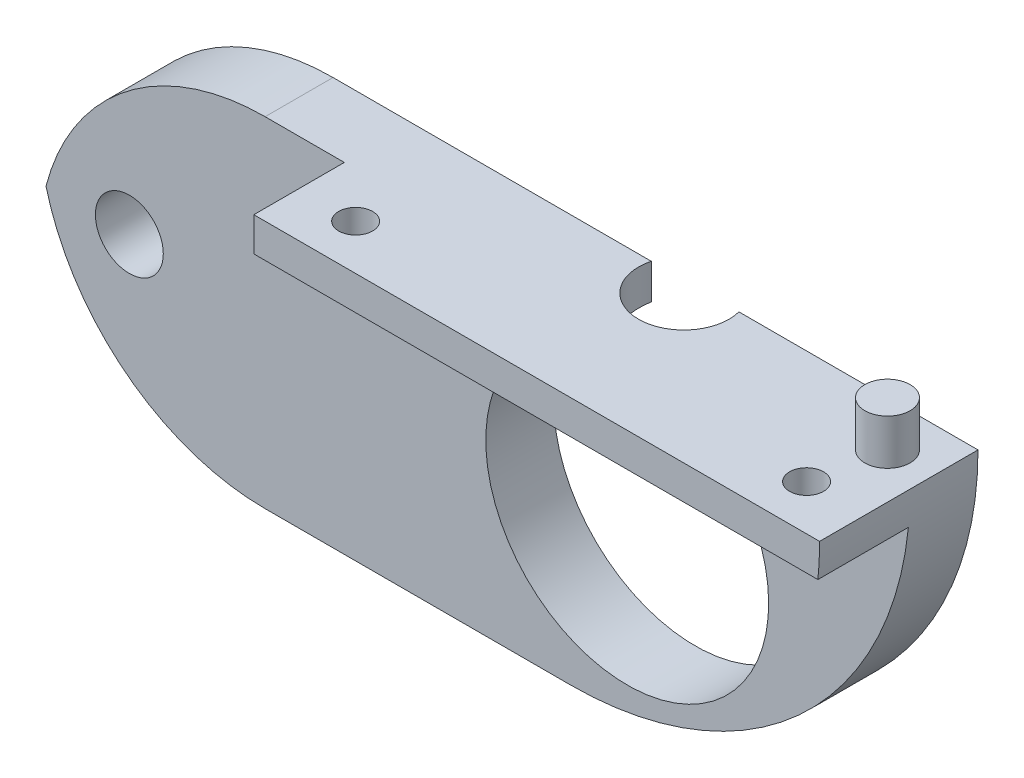
ISO-10303-21;
HEADER;
FILE_DESCRIPTION(('STEP AP214'),'2;1');
FILE_NAME('part.step','',(''),(''),'','','');
FILE_SCHEMA(('AUTOMOTIVE_DESIGN { 1 0 10303 214 1 1 1 1 }'));
ENDSEC;
DATA;
#1=APPLICATION_CONTEXT('core data for automotive mechanical design processes');
#2=APPLICATION_PROTOCOL_DEFINITION('international standard','automotive_design',2000,#1);
#3=PRODUCT_CONTEXT('',#1,'mechanical');
#4=PRODUCT('Part','Part','',(#3));
#5=PRODUCT_RELATED_PRODUCT_CATEGORY('part','',(#4));
#6=PRODUCT_DEFINITION_FORMATION('','',#4);
#7=PRODUCT_DEFINITION_CONTEXT('part definition',#1,'design');
#8=PRODUCT_DEFINITION('design','',#6,#7);
#9=PRODUCT_DEFINITION_SHAPE('','',#8);
#10=(LENGTH_UNIT() NAMED_UNIT(*) SI_UNIT(.MILLI.,.METRE.));
#11=(NAMED_UNIT(*) PLANE_ANGLE_UNIT() SI_UNIT($,.RADIAN.));
#12=(NAMED_UNIT(*) SI_UNIT($,.STERADIAN.) SOLID_ANGLE_UNIT());
#13=UNCERTAINTY_MEASURE_WITH_UNIT(LENGTH_MEASURE(1.E-05),#10,'distance_accuracy_value','');
#14=(GEOMETRIC_REPRESENTATION_CONTEXT(3) GLOBAL_UNCERTAINTY_ASSIGNED_CONTEXT((#13)) GLOBAL_UNIT_ASSIGNED_CONTEXT((#10,
#11,#12)) REPRESENTATION_CONTEXT('',''));
#15=CARTESIAN_POINT('',(0.,0.,0.));
#16=DIRECTION('',(0.,0.,1.));
#17=DIRECTION('',(1.,0.,0.));
#18=AXIS2_PLACEMENT_3D('',#15,#16,#17);
#19=CARTESIAN_POINT('',(0.,30.,6.));
#20=DIRECTION('',(0.,-1.,0.));
#21=DIRECTION('',(1.,0.,0.));
#22=AXIS2_PLACEMENT_3D('',#19,#20,#21);
#23=PLANE('',#22);
#24=CARTESIAN_POINT('',(-5.1503768868014,30.,10.));
#25=DIRECTION('',(0.,-1.,0.));
#26=DIRECTION('',(1.,0.,0.));
#27=AXIS2_PLACEMENT_3D('',#24,#25,#26);
#28=CIRCLE('',#27,1.5);
#29=CARTESIAN_POINT('',(-3.6503768868014,30.,10.));
#30=VERTEX_POINT('',#29);
#31=EDGE_CURVE('E436',#30,#30,#28,.T.);
#32=ORIENTED_EDGE('',*,*,#31,.T.);
#33=EDGE_LOOP('',(#32));
#34=FACE_BOUND('',#33,.T.);
#35=CARTESIAN_POINT('',(-45.,30.,10.));
#36=DIRECTION('',(0.,-1.,0.));
#37=DIRECTION('',(1.,0.,0.));
#38=AXIS2_PLACEMENT_3D('',#35,#36,#37);
#39=CIRCLE('',#38,1.5);
#40=CARTESIAN_POINT('',(-43.5,30.,10.));
#41=VERTEX_POINT('',#40);
#42=EDGE_CURVE('E430',#41,#41,#39,.T.);
#43=ORIENTED_EDGE('',*,*,#42,.T.);
#44=EDGE_LOOP('',(#43));
#45=FACE_BOUND('',#44,.T.);
#46=DIRECTION('',(-1.,0.,0.));
#47=VECTOR('',#46,1.);
#48=CARTESIAN_POINT('',(0.,30.,0.));
#49=LINE('',#48,#47);
#50=CARTESIAN_POINT('',(-28.8729833462074,30.,0.));
#51=VERTEX_POINT('',#50);
#52=CARTESIAN_POINT('',(-57.,30.,0.));
#53=VERTEX_POINT('',#52);
#54=EDGE_CURVE('E146',#51,#53,#49,.T.);
#55=ORIENTED_EDGE('',*,*,#54,.T.);
#56=DIRECTION('',(0.,0.,-1.));
#57=VECTOR('',#56,1.);
#58=CARTESIAN_POINT('',(-57.,30.,6.));
#59=LINE('',#58,#57);
#60=CARTESIAN_POINT('',(-57.,30.,6.));
#61=VERTEX_POINT('',#60);
#62=EDGE_CURVE('E273',#53,#61,#59,.F.);
#63=ORIENTED_EDGE('',*,*,#62,.T.);
#64=DIRECTION('',(-1.,0.,0.));
#65=VECTOR('',#64,1.);
#66=CARTESIAN_POINT('',(0.,30.,6.));
#67=LINE('',#66,#65);
#68=CARTESIAN_POINT('',(-50.,30.,6.));
#69=VERTEX_POINT('',#68);
#70=EDGE_CURVE('E149',#69,#61,#67,.T.);
#71=ORIENTED_EDGE('',*,*,#70,.F.);
#72=DIRECTION('',(0.,0.,-1.));
#73=VECTOR('',#72,1.);
#74=CARTESIAN_POINT('',(-50.,30.,14.));
#75=LINE('',#74,#73);
#76=CARTESIAN_POINT('',(-50.,30.,14.));
#77=VERTEX_POINT('',#76);
#78=EDGE_CURVE('E172',#77,#69,#75,.T.);
#79=ORIENTED_EDGE('',*,*,#78,.F.);
#80=DIRECTION('',(-1.,0.,0.));
#81=VECTOR('',#80,1.);
#82=CARTESIAN_POINT('',(0.,30.,14.));
#83=LINE('',#82,#81);
#84=CARTESIAN_POINT('',(0.,30.,14.));
#85=VERTEX_POINT('',#84);
#86=EDGE_CURVE('E182',#85,#77,#83,.T.);
#87=ORIENTED_EDGE('',*,*,#86,.F.);
#88=DIRECTION('',(0.,0.,-1.));
#89=VECTOR('',#88,1.);
#90=CARTESIAN_POINT('',(0.,30.,6.));
#91=LINE('',#90,#89);
#92=CARTESIAN_POINT('',(0.,30.,0.));
#93=VERTEX_POINT('',#92);
#94=EDGE_CURVE('E144',#85,#93,#91,.T.);
#95=ORIENTED_EDGE('',*,*,#94,.T.);
#96=CARTESIAN_POINT('',(-21.1270166537926,30.,0.));
#97=VERTEX_POINT('',#96);
#98=EDGE_CURVE('E136',#93,#97,#49,.T.);
#99=ORIENTED_EDGE('',*,*,#98,.T.);
#100=CARTESIAN_POINT('',(-25.,30.,0.999999999999999));
#101=DIRECTION('',(0.,1.,0.));
#102=DIRECTION('',(-1.,0.,0.));
#103=AXIS2_PLACEMENT_3D('',#100,#101,#102);
#104=CIRCLE('',#103,4.);
#105=EDGE_CURVE('E119',#51,#97,#104,.T.);
#106=ORIENTED_EDGE('',*,*,#105,.F.);
#107=EDGE_LOOP('',(#55,#63,#71,#79,#87,#95,#99,#106));
#108=FACE_BOUND('',#107,.T.);
#109=CARTESIAN_POINT('',(-4.,30.,4.));
#110=DIRECTION('',(0.,-1.,0.));
#111=DIRECTION('',(1.,0.,0.));
#112=AXIS2_PLACEMENT_3D('',#109,#110,#111);
#113=CIRCLE('',#112,2.);
#114=CARTESIAN_POINT('',(-2.,30.,4.));
#115=VERTEX_POINT('',#114);
#116=EDGE_CURVE('E11',#115,#115,#113,.F.);
#117=ORIENTED_EDGE('',*,*,#116,.F.);
#118=EDGE_LOOP('',(#117));
#119=FACE_BOUND('',#118,.T.);
#120=ADVANCED_FACE('F35',(#34,#45,#108,#119),#23,.F.);
#121=CARTESIAN_POINT('',(0.,0.,6.));
#122=DIRECTION('',(0.,1.,0.));
#123=DIRECTION('',(-1.,0.,0.));
#124=AXIS2_PLACEMENT_3D('',#121,#122,#123);
#125=PLANE('',#124);
#126=DIRECTION('',(1.,0.,0.));
#127=VECTOR('',#126,1.);
#128=CARTESIAN_POINT('',(0.,0.,0.));
#129=LINE('',#128,#127);
#130=CARTESIAN_POINT('',(-57.,0.,0.));
#131=VERTEX_POINT('',#130);
#132=CARTESIAN_POINT('',(-30.,0.,0.));
#133=VERTEX_POINT('',#132);
#134=EDGE_CURVE('E145',#131,#133,#129,.T.);
#135=ORIENTED_EDGE('',*,*,#134,.T.);
#136=DIRECTION('',(0.,0.,-1.));
#137=VECTOR('',#136,1.);
#138=CARTESIAN_POINT('',(-30.,0.,6.));
#139=LINE('',#138,#137);
#140=CARTESIAN_POINT('',(-30.,0.,6.));
#141=VERTEX_POINT('',#140);
#142=EDGE_CURVE('E254',#133,#141,#139,.F.);
#143=ORIENTED_EDGE('',*,*,#142,.T.);
#144=DIRECTION('',(1.,0.,0.));
#145=VECTOR('',#144,1.);
#146=CARTESIAN_POINT('',(0.,0.,6.));
#147=LINE('',#146,#145);
#148=CARTESIAN_POINT('',(-57.,0.,6.));
#149=VERTEX_POINT('',#148);
#150=EDGE_CURVE('E152',#149,#141,#147,.T.);
#151=ORIENTED_EDGE('',*,*,#150,.F.);
#152=DIRECTION('',(0.,0.,-1.));
#153=VECTOR('',#152,1.);
#154=CARTESIAN_POINT('',(-57.,0.,6.));
#155=LINE('',#154,#153);
#156=EDGE_CURVE('E244',#149,#131,#155,.T.);
#157=ORIENTED_EDGE('',*,*,#156,.T.);
#158=EDGE_LOOP('',(#135,#143,#151,#157));
#159=FACE_BOUND('',#158,.T.);
#160=ADVANCED_FACE('F218',(#159),#125,.F.);
#161=CARTESIAN_POINT('',(0.,0.,6.));
#162=DIRECTION('',(0.,0.,1.));
#163=DIRECTION('',(1.,0.,0.));
#164=AXIS2_PLACEMENT_3D('',#161,#162,#163);
#165=PLANE('',#164);
#166=ORIENTED_EDGE('',*,*,#150,.T.);
#167=CARTESIAN_POINT('',(-30.,30.,6.));
#168=DIRECTION('',(0.,0.,1.));
#169=DIRECTION('',(1.,0.,0.));
#170=AXIS2_PLACEMENT_3D('',#167,#168,#169);
#171=CIRCLE('',#170,30.);
#172=CARTESIAN_POINT('',(-0.1503768868014,27.,6.));
#173=VERTEX_POINT('',#172);
#174=EDGE_CURVE('E58',#141,#173,#171,.T.);
#175=ORIENTED_EDGE('',*,*,#174,.T.);
#176=DIRECTION('',(1.,0.,0.));
#177=VECTOR('',#176,1.);
#178=CARTESIAN_POINT('',(0.,27.,6.));
#179=LINE('',#178,#177);
#180=CARTESIAN_POINT('',(-21.5,27.,6.));
#181=VERTEX_POINT('',#180);
#182=EDGE_CURVE('E156',#181,#173,#179,.T.);
#183=ORIENTED_EDGE('',*,*,#182,.F.);
#184=CARTESIAN_POINT('',(-25.,15.,6.));
#185=DIRECTION('',(0.,0.,1.));
#186=DIRECTION('',(1.,0.,0.));
#187=AXIS2_PLACEMENT_3D('',#184,#185,#186);
#188=CIRCLE('',#187,12.5);
#189=CARTESIAN_POINT('',(-28.5,27.,6.));
#190=VERTEX_POINT('',#189);
#191=EDGE_CURVE('E166',#190,#181,#188,.T.);
#192=ORIENTED_EDGE('',*,*,#191,.F.);
#193=CARTESIAN_POINT('',(-50.,27.,6.));
#194=VERTEX_POINT('',#193);
#195=EDGE_CURVE('E178',#194,#190,#179,.T.);
#196=ORIENTED_EDGE('',*,*,#195,.F.);
#197=DIRECTION('',(0.,-1.,0.));
#198=VECTOR('',#197,1.);
#199=CARTESIAN_POINT('',(-50.,30.,6.));
#200=LINE('',#199,#198);
#201=EDGE_CURVE('E193',#69,#194,#200,.T.);
#202=ORIENTED_EDGE('',*,*,#201,.F.);
#203=ORIENTED_EDGE('',*,*,#70,.T.);
#204=CARTESIAN_POINT('',(-57.,9.99999999999999,6.));
#205=DIRECTION('',(0.,0.,1.));
#206=DIRECTION('',(1.,0.,0.));
#207=AXIS2_PLACEMENT_3D('',#204,#205,#206);
#208=CIRCLE('',#207,20.);
#209=CARTESIAN_POINT('',(-76.3649167310371,15.,6.));
#210=VERTEX_POINT('',#209);
#211=EDGE_CURVE('E252',#61,#210,#208,.T.);
#212=ORIENTED_EDGE('',*,*,#211,.T.);
#213=CARTESIAN_POINT('',(-57.,20.,6.));
#214=DIRECTION('',(0.,0.,1.));
#215=DIRECTION('',(1.,0.,0.));
#216=AXIS2_PLACEMENT_3D('',#213,#214,#215);
#217=CIRCLE('',#216,20.);
#218=EDGE_CURVE('E246',#210,#149,#217,.T.);
#219=ORIENTED_EDGE('',*,*,#218,.T.);
#220=EDGE_LOOP('',(#166,#175,#183,#192,#196,#202,#203,#212,#219));
#221=FACE_BOUND('',#220,.T.);
#222=CARTESIAN_POINT('',(-69.,15.,6.));
#223=DIRECTION('',(0.,0.,1.));
#224=DIRECTION('',(1.,0.,0.));
#225=AXIS2_PLACEMENT_3D('',#222,#223,#224);
#226=CIRCLE('',#225,3.00000000000001);
#227=CARTESIAN_POINT('',(-66.,15.,6.));
#228=VERTEX_POINT('',#227);
#229=EDGE_CURVE('E168',#228,#228,#226,.T.);
#230=ORIENTED_EDGE('',*,*,#229,.F.);
#231=EDGE_LOOP('',(#230));
#232=FACE_BOUND('',#231,.T.);
#233=ADVANCED_FACE('F224',(#221,#232),#165,.T.);
#234=CARTESIAN_POINT('',(0.,0.,0.));
#235=DIRECTION('',(0.,0.,1.));
#236=DIRECTION('',(1.,0.,0.));
#237=AXIS2_PLACEMENT_3D('',#234,#235,#236);
#238=PLANE('',#237);
#239=CARTESIAN_POINT('',(-69.,15.,0.));
#240=DIRECTION('',(0.,0.,1.));
#241=DIRECTION('',(1.,0.,0.));
#242=AXIS2_PLACEMENT_3D('',#239,#240,#241);
#243=CIRCLE('',#242,3.00000000000001);
#244=CARTESIAN_POINT('',(-66.,15.,0.));
#245=VERTEX_POINT('',#244);
#246=EDGE_CURVE('E171',#245,#245,#243,.T.);
#247=ORIENTED_EDGE('',*,*,#246,.T.);
#248=EDGE_LOOP('',(#247));
#249=FACE_BOUND('',#248,.T.);
#250=ORIENTED_EDGE('',*,*,#98,.F.);
#251=CARTESIAN_POINT('',(-30.,30.,0.));
#252=DIRECTION('',(0.,0.,1.));
#253=DIRECTION('',(1.,0.,0.));
#254=AXIS2_PLACEMENT_3D('',#251,#252,#253);
#255=CIRCLE('',#254,30.);
#256=EDGE_CURVE('E251',#93,#133,#255,.F.);
#257=ORIENTED_EDGE('',*,*,#256,.T.);
#258=ORIENTED_EDGE('',*,*,#134,.F.);
#259=CARTESIAN_POINT('',(-57.,20.,0.));
#260=DIRECTION('',(0.,0.,1.));
#261=DIRECTION('',(1.,0.,0.));
#262=AXIS2_PLACEMENT_3D('',#259,#260,#261);
#263=CIRCLE('',#262,20.);
#264=CARTESIAN_POINT('',(-76.3649167310371,15.,0.));
#265=VERTEX_POINT('',#264);
#266=EDGE_CURVE('E248',#131,#265,#263,.F.);
#267=ORIENTED_EDGE('',*,*,#266,.T.);
#268=CARTESIAN_POINT('',(-57.,9.99999999999999,0.));
#269=DIRECTION('',(0.,0.,1.));
#270=DIRECTION('',(1.,0.,0.));
#271=AXIS2_PLACEMENT_3D('',#268,#269,#270);
#272=CIRCLE('',#271,20.);
#273=EDGE_CURVE('E275',#265,#53,#272,.F.);
#274=ORIENTED_EDGE('',*,*,#273,.T.);
#275=ORIENTED_EDGE('',*,*,#54,.F.);
#276=DIRECTION('',(0.,1.,0.));
#277=VECTOR('',#276,1.);
#278=CARTESIAN_POINT('',(-28.8729833462074,-0.00102500000000936,0.));
#279=LINE('',#278,#277);
#280=CARTESIAN_POINT('',(-28.8729833462074,26.8848643240047,0.));
#281=VERTEX_POINT('',#280);
#282=EDGE_CURVE('E125',#281,#51,#279,.T.);
#283=ORIENTED_EDGE('',*,*,#282,.F.);
#284=CARTESIAN_POINT('',(-25.,15.,0.));
#285=DIRECTION('',(0.,0.,1.));
#286=DIRECTION('',(1.,0.,0.));
#287=AXIS2_PLACEMENT_3D('',#284,#285,#286);
#288=CIRCLE('',#287,12.5);
#289=CARTESIAN_POINT('',(-21.1270166537926,26.8848643240047,0.));
#290=VERTEX_POINT('',#289);
#291=EDGE_CURVE('E139',#281,#290,#288,.T.);
#292=ORIENTED_EDGE('',*,*,#291,.T.);
#293=DIRECTION('',(0.,1.,0.));
#294=VECTOR('',#293,1.);
#295=CARTESIAN_POINT('',(-21.1270166537926,-0.00102500000000796,0.));
#296=LINE('',#295,#294);
#297=EDGE_CURVE('E122',#97,#290,#296,.F.);
#298=ORIENTED_EDGE('',*,*,#297,.F.);
#299=EDGE_LOOP('',(#250,#257,#258,#267,#274,#275,#283,#292,#298));
#300=FACE_BOUND('',#299,.T.);
#301=ADVANCED_FACE('F135',(#249,#300),#238,.F.);
#302=CARTESIAN_POINT('',(-25.,15.,0.));
#303=DIRECTION('',(0.,0.,1.));
#304=DIRECTION('',(1.,0.,0.));
#305=AXIS2_PLACEMENT_3D('',#302,#303,#304);
#306=CYLINDRICAL_SURFACE('',#305,12.5);
#307=ORIENTED_EDGE('',*,*,#291,.F.);
#308=CARTESIAN_POINT('',(-21.1270166537926,26.8848643240047,0.));
#309=CARTESIAN_POINT('',(-21.1002358808906,26.8761270874927,0.103667183956193));
#310=CARTESIAN_POINT('',(-21.0776162507261,26.8686653195695,0.20852133838656));
#311=CARTESIAN_POINT('',(-21.0408443006835,26.8564550381195,0.419860668305291));
#312=CARTESIAN_POINT('',(-21.0266921136834,26.851706567172,0.526345869362457));
#313=CARTESIAN_POINT('',(-21.0070190881322,26.8450915887842,0.740003806151686));
#314=CARTESIAN_POINT('',(-21.0014823741404,26.8432197806933,0.847174911057992));
#315=CARTESIAN_POINT('',(-20.9990375428634,26.8423943851246,1.06161981620201));
#316=CARTESIAN_POINT('',(-21.0021290287125,26.8434406634254,1.16889361148946));
#317=CARTESIAN_POINT('',(-21.0169196928066,26.8484232711112,1.38284608095715));
#318=CARTESIAN_POINT('',(-21.0286237644191,26.8523612434519,1.48952438206651));
#319=CARTESIAN_POINT('',(-21.0605279548334,26.8630025419002,1.70147498559221));
#320=CARTESIAN_POINT('',(-21.0807312460839,26.8697069005808,1.80674674784477));
#321=CARTESIAN_POINT('',(-21.1538439248776,26.8936878820143,2.11925900247744));
#322=CARTESIAN_POINT('',(-21.2192722652743,26.9148383614402,2.32342494107594));
#323=CARTESIAN_POINT('',(-21.382086499668,26.965281131648,2.71961851931122));
#324=CARTESIAN_POINT('',(-21.4797677044746,26.9946482607626,2.91151365940472));
#325=CARTESIAN_POINT('',(-21.7041633338783,27.0582352237518,3.27670838713107));
#326=CARTESIAN_POINT('',(-21.8308906647158,27.0924572122318,3.44999965798222));
#327=CARTESIAN_POINT('',(-22.1169476101471,27.16391064307,3.78177288447341));
#328=CARTESIAN_POINT('',(-22.277550450806,27.2012076877469,3.9391442740362));
#329=CARTESIAN_POINT('',(-22.6231703218229,27.2732147031089,4.22505489221386));
#330=CARTESIAN_POINT('',(-22.808188068931,27.3079245977961,4.35359327407682));
#331=CARTESIAN_POINT('',(-23.2005437623364,27.3714146029381,4.57964451684881));
#332=CARTESIAN_POINT('',(-23.4081386052178,27.4001125384524,4.67673623823083));
#333=CARTESIAN_POINT('',(-23.8378479489576,27.4477326397171,4.83428299767666));
#334=CARTESIAN_POINT('',(-24.0599583556755,27.4666575486757,4.89474831729554));
#335=CARTESIAN_POINT('',(-24.5032188595773,27.4920206173642,4.9751702372431));
#336=CARTESIAN_POINT('',(-24.7240762078723,27.4989118053659,4.99659790334499));
#337=CARTESIAN_POINT('',(-25.16632577283,27.5008479591681,5.00265132898455));
#338=CARTESIAN_POINT('',(-25.3877178878799,27.495895021957,4.98728360310187));
#339=CARTESIAN_POINT('',(-25.8179362075324,27.4750167777979,4.92134704900882));
#340=CARTESIAN_POINT('',(-26.0269404981695,27.4594180683795,4.87182554694307));
#341=CARTESIAN_POINT('',(-26.433564087682,27.4192056313644,4.74039602008452));
#342=CARTESIAN_POINT('',(-26.6311824699421,27.3945911791314,4.65848539198798));
#343=CARTESIAN_POINT('',(-27.0142644298725,27.3381954762507,4.46266190870307));
#344=CARTESIAN_POINT('',(-27.1993697672115,27.3062698781093,4.34809122300356));
#345=CARTESIAN_POINT('',(-27.548236733935,27.238795462178,4.0908708457459));
#346=CARTESIAN_POINT('',(-27.7119902462025,27.2032452755622,3.94821052705607));
#347=CARTESIAN_POINT('',(-28.0207819405716,27.1305865159457,3.63170081136469));
#348=CARTESIAN_POINT('',(-28.164720370022,27.093476310342,3.45677856829583));
#349=CARTESIAN_POINT('',(-28.4213850061714,27.0233894891878,3.08450054850874));
#350=CARTESIAN_POINT('',(-28.5341180152337,26.9904119736254,2.88714967418315));
#351=CARTESIAN_POINT('',(-28.6772163591035,26.9469891315672,2.57830262965658));
#352=CARTESIAN_POINT('',(-28.7206168759465,26.9335101808027,2.47308950767208));
#353=CARTESIAN_POINT('',(-28.7983650438987,26.9089920135164,2.25910940665284));
#354=CARTESIAN_POINT('',(-28.8327164973153,26.897951772594,2.15034394193234));
#355=CARTESIAN_POINT('',(-28.8920568397875,26.8786728173475,1.93001105075621));
#356=CARTESIAN_POINT('',(-28.9170426234429,26.8704350323247,1.81844270800332));
#357=CARTESIAN_POINT('',(-28.9573834586627,26.8570472167658,1.59344038982447));
#358=CARTESIAN_POINT('',(-28.9727426181549,26.8518958692088,1.48000723139864));
#359=CARTESIAN_POINT('',(-28.993707884804,26.8448479238819,1.25188514311373));
#360=CARTESIAN_POINT('',(-28.9992920724555,26.8429586411311,1.13719396982362));
#361=CARTESIAN_POINT('',(-29.0005817212809,26.8425225509889,0.907742480973441));
#362=CARTESIAN_POINT('',(-28.9962866095193,26.8439759374506,0.79298216178922));
#363=CARTESIAN_POINT('',(-28.9778337046938,26.8501880133592,0.564051857439433));
#364=CARTESIAN_POINT('',(-28.9636504993197,26.854955219199,0.449884158647338));
#365=CARTESIAN_POINT('',(-28.925564289871,26.8676139926281,0.223356628060075));
#366=CARTESIAN_POINT('',(-28.9016612806332,26.8755055618771,0.110996797225293));
#367=CARTESIAN_POINT('',(-28.8729833462074,26.8848643240047,0.));
#368=B_SPLINE_CURVE_WITH_KNOTS('',3,(#308,#309,#310,#311,#312,#313,#314,#315,#316,#317,#318,
#319,#320,#321,#322,#323,#324,#325,#326,#327,#328,#329,#330,#331,#332,#333,#334,#335,#336,#337,
#338,#339,#340,#341,#342,#343,#344,#345,#346,#347,#348,#349,#350,#351,#352,#353,#354,#355,#356,
#357,#358,#359,#360,#361,#362,#363,#364,#365,#366,#367),.UNSPECIFIED.,.F.,.F.,(4,2,2,2,2,2,2,2,
2,2,2,2,2,2,2,2,2,2,2,2,2,2,2,2,2,2,2,2,2,4),(0.,0.322192352244594,0.644389760458011,
0.965992760378649,1.28758096798049,1.6093520318718,1.93124330787807,2.57434710330334,
3.22351053834427,3.87296298120764,4.55359855562455,5.23425411595667,5.92368062355725,
6.61291350947683,7.27558968959337,7.93814855236931,8.58124414117151,9.22439142984244,
9.88153917934563,10.5389360264759,11.2244446762839,11.909803776508,12.2532675315073,
12.5965867361362,12.940019675551,13.2833059633466,13.6273610587079,13.9714361075382,
14.3163987015464,14.6613614788013),.UNSPECIFIED.);
#369=EDGE_CURVE('E130',#290,#281,#368,.T.);
#370=ORIENTED_EDGE('',*,*,#369,.F.);
#371=EDGE_LOOP('',(#307,#370));
#372=FACE_BOUND('',#371,.T.);
#373=EDGE_CURVE('E163',#181,#190,#188,.T.);
#374=ORIENTED_EDGE('',*,*,#373,.T.);
#375=ORIENTED_EDGE('',*,*,#191,.T.);
#376=EDGE_LOOP('',(#374,#375));
#377=FACE_BOUND('',#376,.T.);
#378=ADVANCED_FACE('F295',(#372,#377),#306,.F.);
#379=CARTESIAN_POINT('',(-69.,15.,0.));
#380=DIRECTION('',(0.,0.,1.));
#381=DIRECTION('',(1.,0.,0.));
#382=AXIS2_PLACEMENT_3D('',#379,#380,#381);
#383=CYLINDRICAL_SURFACE('',#382,3.00000000000001);
#384=ORIENTED_EDGE('',*,*,#246,.F.);
#385=EDGE_LOOP('',(#384));
#386=FACE_BOUND('',#385,.T.);
#387=ORIENTED_EDGE('',*,*,#229,.T.);
#388=EDGE_LOOP('',(#387));
#389=FACE_BOUND('',#388,.T.);
#390=ADVANCED_FACE('F306',(#386,#389),#383,.F.);
#391=CARTESIAN_POINT('',(0.,0.,6.));
#392=DIRECTION('',(0.,0.,-1.));
#393=DIRECTION('',(-1.,0.,0.));
#394=AXIS2_PLACEMENT_3D('',#391,#392,#393);
#395=PLANE('',#394);
#396=ORIENTED_EDGE('',*,*,#373,.F.);
#397=EDGE_CURVE('E183',#190,#181,#179,.T.);
#398=ORIENTED_EDGE('',*,*,#397,.F.);
#399=EDGE_LOOP('',(#396,#398));
#400=FACE_BOUND('',#399,.T.);
#401=ADVANCED_FACE('F292',(#400),#395,.T.);
#402=CARTESIAN_POINT('',(-50.,30.,14.));
#403=DIRECTION('',(1.,0.,0.));
#404=DIRECTION('',(0.,0.,-1.));
#405=AXIS2_PLACEMENT_3D('',#402,#403,#404);
#406=PLANE('',#405);
#407=ORIENTED_EDGE('',*,*,#201,.T.);
#408=DIRECTION('',(0.,0.,-1.));
#409=VECTOR('',#408,1.);
#410=CARTESIAN_POINT('',(-50.,27.,14.));
#411=LINE('',#410,#409);
#412=CARTESIAN_POINT('',(-50.,27.,14.));
#413=VERTEX_POINT('',#412);
#414=EDGE_CURVE('E175',#413,#194,#411,.T.);
#415=ORIENTED_EDGE('',*,*,#414,.F.);
#416=DIRECTION('',(0.,-1.,0.));
#417=VECTOR('',#416,1.);
#418=CARTESIAN_POINT('',(-50.,30.,14.));
#419=LINE('',#418,#417);
#420=EDGE_CURVE('E185',#77,#413,#419,.T.);
#421=ORIENTED_EDGE('',*,*,#420,.F.);
#422=ORIENTED_EDGE('',*,*,#78,.T.);
#423=EDGE_LOOP('',(#407,#415,#421,#422));
#424=FACE_BOUND('',#423,.T.);
#425=ADVANCED_FACE('F297',(#424),#406,.F.);
#426=CARTESIAN_POINT('',(0.,27.,14.));
#427=DIRECTION('',(0.,1.,0.));
#428=DIRECTION('',(-1.,0.,0.));
#429=AXIS2_PLACEMENT_3D('',#426,#427,#428);
#430=PLANE('',#429);
#431=CARTESIAN_POINT('',(-5.1503768868014,27.,10.));
#432=DIRECTION('',(0.,-1.,0.));
#433=DIRECTION('',(1.,0.,0.));
#434=AXIS2_PLACEMENT_3D('',#431,#432,#433);
#435=CIRCLE('',#434,1.5);
#436=CARTESIAN_POINT('',(-3.6503768868014,27.,10.));
#437=VERTEX_POINT('',#436);
#438=EDGE_CURVE('E438',#437,#437,#435,.T.);
#439=ORIENTED_EDGE('',*,*,#438,.F.);
#440=EDGE_LOOP('',(#439));
#441=FACE_BOUND('',#440,.T.);
#442=CARTESIAN_POINT('',(-45.,27.,10.));
#443=DIRECTION('',(0.,-1.,0.));
#444=DIRECTION('',(1.,0.,0.));
#445=AXIS2_PLACEMENT_3D('',#442,#443,#444);
#446=CIRCLE('',#445,1.5);
#447=CARTESIAN_POINT('',(-43.5,27.,10.));
#448=VERTEX_POINT('',#447);
#449=EDGE_CURVE('E433',#448,#448,#446,.T.);
#450=ORIENTED_EDGE('',*,*,#449,.F.);
#451=EDGE_LOOP('',(#450));
#452=FACE_BOUND('',#451,.T.);
#453=ORIENTED_EDGE('',*,*,#182,.T.);
#454=DIRECTION('',(0.,0.,-1.));
#455=VECTOR('',#454,1.);
#456=CARTESIAN_POINT('',(-0.1503768868014,27.,6.));
#457=LINE('',#456,#455);
#458=CARTESIAN_POINT('',(-0.1503768868014,27.,14.));
#459=VERTEX_POINT('',#458);
#460=EDGE_CURVE('E50',#173,#459,#457,.F.);
#461=ORIENTED_EDGE('',*,*,#460,.T.);
#462=DIRECTION('',(1.,0.,0.));
#463=VECTOR('',#462,1.);
#464=CARTESIAN_POINT('',(0.,27.,14.));
#465=LINE('',#464,#463);
#466=EDGE_CURVE('E177',#413,#459,#465,.T.);
#467=ORIENTED_EDGE('',*,*,#466,.F.);
#468=ORIENTED_EDGE('',*,*,#414,.T.);
#469=ORIENTED_EDGE('',*,*,#195,.T.);
#470=ORIENTED_EDGE('',*,*,#397,.T.);
#471=EDGE_LOOP('',(#453,#461,#467,#468,#469,#470));
#472=FACE_BOUND('',#471,.T.);
#473=ADVANCED_FACE('F289',(#441,#452,#472),#430,.F.);
#474=CARTESIAN_POINT('',(0.,0.,14.));
#475=DIRECTION('',(0.,0.,-1.));
#476=DIRECTION('',(-1.,0.,0.));
#477=AXIS2_PLACEMENT_3D('',#474,#475,#476);
#478=PLANE('',#477);
#479=ORIENTED_EDGE('',*,*,#466,.T.);
#480=CARTESIAN_POINT('',(-30.,30.,14.));
#481=DIRECTION('',(0.,0.,-1.));
#482=DIRECTION('',(-1.,0.,0.));
#483=AXIS2_PLACEMENT_3D('',#480,#481,#482);
#484=CIRCLE('',#483,30.);
#485=EDGE_CURVE('E43',#459,#85,#484,.F.);
#486=ORIENTED_EDGE('',*,*,#485,.T.);
#487=ORIENTED_EDGE('',*,*,#86,.T.);
#488=ORIENTED_EDGE('',*,*,#420,.T.);
#489=EDGE_LOOP('',(#479,#486,#487,#488));
#490=FACE_BOUND('',#489,.T.);
#491=ADVANCED_FACE('F240',(#490),#478,.F.);
#492=CARTESIAN_POINT('',(-25.,-0.00102500000000866,0.999999999999999));
#493=DIRECTION('',(0.,1.,0.));
#494=DIRECTION('',(-1.,0.,0.));
#495=AXIS2_PLACEMENT_3D('',#492,#493,#494);
#496=CYLINDRICAL_SURFACE('',#495,4.);
#497=ORIENTED_EDGE('',*,*,#297,.T.);
#498=ORIENTED_EDGE('',*,*,#369,.T.);
#499=ORIENTED_EDGE('',*,*,#282,.T.);
#500=ORIENTED_EDGE('',*,*,#105,.T.);
#501=EDGE_LOOP('',(#497,#498,#499,#500));
#502=FACE_BOUND('',#501,.T.);
#503=ADVANCED_FACE('F121',(#502),#496,.F.);
#504=CARTESIAN_POINT('',(-57.,20.,6.));
#505=DIRECTION('',(0.,0.,-1.));
#506=DIRECTION('',(-1.,0.,0.));
#507=AXIS2_PLACEMENT_3D('',#504,#505,#506);
#508=CYLINDRICAL_SURFACE('',#507,20.);
#509=ORIENTED_EDGE('',*,*,#156,.F.);
#510=ORIENTED_EDGE('',*,*,#218,.F.);
#511=DIRECTION('',(0.,0.,-1.));
#512=VECTOR('',#511,1.);
#513=CARTESIAN_POINT('',(-76.3649167310371,15.,3.));
#514=LINE('',#513,#512);
#515=EDGE_CURVE('E259',#265,#210,#514,.F.);
#516=ORIENTED_EDGE('',*,*,#515,.F.);
#517=ORIENTED_EDGE('',*,*,#266,.F.);
#518=EDGE_LOOP('',(#509,#510,#516,#517));
#519=FACE_BOUND('',#518,.T.);
#520=ADVANCED_FACE('F233',(#519),#508,.T.);
#521=CARTESIAN_POINT('',(-57.,9.99999999999999,6.));
#522=DIRECTION('',(0.,0.,-1.));
#523=DIRECTION('',(-1.,0.,0.));
#524=AXIS2_PLACEMENT_3D('',#521,#522,#523);
#525=CYLINDRICAL_SURFACE('',#524,20.);
#526=ORIENTED_EDGE('',*,*,#211,.F.);
#527=ORIENTED_EDGE('',*,*,#62,.F.);
#528=ORIENTED_EDGE('',*,*,#273,.F.);
#529=ORIENTED_EDGE('',*,*,#515,.T.);
#530=EDGE_LOOP('',(#526,#527,#528,#529));
#531=FACE_BOUND('',#530,.T.);
#532=ADVANCED_FACE('F231',(#531),#525,.T.);
#533=CARTESIAN_POINT('',(-30.,30.,6.));
#534=DIRECTION('',(0.,0.,-1.));
#535=DIRECTION('',(-1.,0.,0.));
#536=AXIS2_PLACEMENT_3D('',#533,#534,#535);
#537=CYLINDRICAL_SURFACE('',#536,30.);
#538=ORIENTED_EDGE('',*,*,#174,.F.);
#539=ORIENTED_EDGE('',*,*,#142,.F.);
#540=ORIENTED_EDGE('',*,*,#256,.F.);
#541=ORIENTED_EDGE('',*,*,#94,.F.);
#542=ORIENTED_EDGE('',*,*,#485,.F.);
#543=ORIENTED_EDGE('',*,*,#460,.F.);
#544=EDGE_LOOP('',(#538,#539,#540,#541,#542,#543));
#545=FACE_BOUND('',#544,.T.);
#546=ADVANCED_FACE('F37',(#545),#537,.T.);
#547=CARTESIAN_POINT('',(-4.,34.,4.));
#548=DIRECTION('',(0.,-1.,0.));
#549=DIRECTION('',(1.,0.,0.));
#550=AXIS2_PLACEMENT_3D('',#547,#548,#549);
#551=CYLINDRICAL_SURFACE('',#550,2.);
#552=CARTESIAN_POINT('',(-4.,34.,4.));
#553=DIRECTION('',(0.,1.,0.));
#554=DIRECTION('',(-1.,0.,0.));
#555=AXIS2_PLACEMENT_3D('',#552,#553,#554);
#556=CIRCLE('',#555,2.);
#557=CARTESIAN_POINT('',(-6.,34.,4.));
#558=VERTEX_POINT('',#557);
#559=EDGE_CURVE('E260',#558,#558,#556,.T.);
#560=ORIENTED_EDGE('',*,*,#559,.F.);
#561=EDGE_LOOP('',(#560));
#562=FACE_BOUND('',#561,.T.);
#563=ORIENTED_EDGE('',*,*,#116,.T.);
#564=EDGE_LOOP('',(#563));
#565=FACE_BOUND('',#564,.T.);
#566=ADVANCED_FACE('F198',(#562,#565),#551,.T.);
#567=CARTESIAN_POINT('',(-4.,34.,4.));
#568=DIRECTION('',(0.,1.,0.));
#569=DIRECTION('',(-1.,0.,0.));
#570=AXIS2_PLACEMENT_3D('',#567,#568,#569);
#571=PLANE('',#570);
#572=ORIENTED_EDGE('',*,*,#559,.T.);
#573=EDGE_LOOP('',(#572));
#574=FACE_BOUND('',#573,.T.);
#575=ADVANCED_FACE('F201',(#574),#571,.T.);
#576=CARTESIAN_POINT('',(-45.,37.,10.));
#577=DIRECTION('',(0.,-1.,0.));
#578=DIRECTION('',(1.,0.,0.));
#579=AXIS2_PLACEMENT_3D('',#576,#577,#578);
#580=CYLINDRICAL_SURFACE('',#579,1.5);
#581=ORIENTED_EDGE('',*,*,#449,.T.);
#582=EDGE_LOOP('',(#581));
#583=FACE_BOUND('',#582,.T.);
#584=ORIENTED_EDGE('',*,*,#42,.F.);
#585=EDGE_LOOP('',(#584));
#586=FACE_BOUND('',#585,.T.);
#587=ADVANCED_FACE('F205',(#583,#586),#580,.F.);
#588=CARTESIAN_POINT('',(-5.1503768868014,37.,10.));
#589=DIRECTION('',(0.,-1.,0.));
#590=DIRECTION('',(1.,0.,0.));
#591=AXIS2_PLACEMENT_3D('',#588,#589,#590);
#592=CYLINDRICAL_SURFACE('',#591,1.5);
#593=ORIENTED_EDGE('',*,*,#438,.T.);
#594=EDGE_LOOP('',(#593));
#595=FACE_BOUND('',#594,.T.);
#596=ORIENTED_EDGE('',*,*,#31,.F.);
#597=EDGE_LOOP('',(#596));
#598=FACE_BOUND('',#597,.T.);
#599=ADVANCED_FACE('F209',(#595,#598),#592,.F.);
#600=CLOSED_SHELL('',(#120,#160,#233,#301,#378,#390,#401,#425,#473,#491,#503,#520,#532,#546,
#566,#575,#587,#599));
#601=MANIFOLD_SOLID_BREP('B2',#600);
#602=ADVANCED_BREP_SHAPE_REPRESENTATION('',(#18,#601),#14);
#603=SHAPE_DEFINITION_REPRESENTATION(#9,#602);
ENDSEC;
END-ISO-10303-21;
